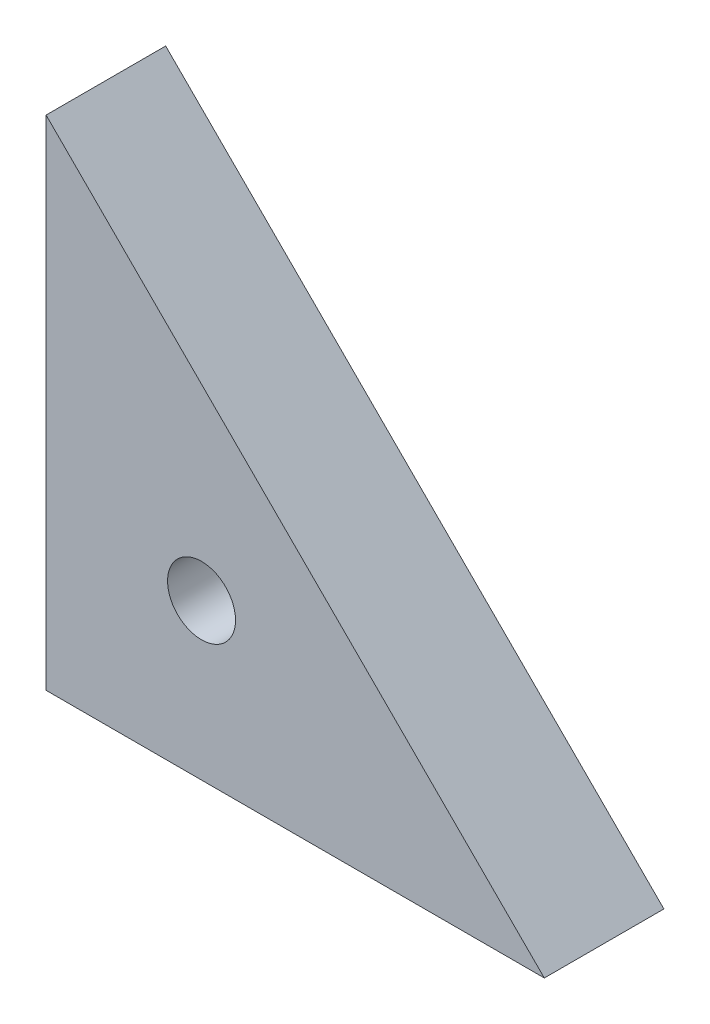
ISO-10303-21;
HEADER;
FILE_DESCRIPTION(('STEP AP214'),'2;1');
FILE_NAME('part.step','',(''),(''),'','','');
FILE_SCHEMA(('AUTOMOTIVE_DESIGN { 1 0 10303 214 1 1 1 1 }'));
ENDSEC;
DATA;
#1=APPLICATION_CONTEXT('core data for automotive mechanical design processes');
#2=APPLICATION_PROTOCOL_DEFINITION('international standard','automotive_design',2000,#1);
#3=PRODUCT_CONTEXT('',#1,'mechanical');
#4=PRODUCT('Part','Part','',(#3));
#5=PRODUCT_RELATED_PRODUCT_CATEGORY('part','',(#4));
#6=PRODUCT_DEFINITION_FORMATION('','',#4);
#7=PRODUCT_DEFINITION_CONTEXT('part definition',#1,'design');
#8=PRODUCT_DEFINITION('design','',#6,#7);
#9=PRODUCT_DEFINITION_SHAPE('','',#8);
#10=(LENGTH_UNIT() NAMED_UNIT(*) SI_UNIT(.MILLI.,.METRE.));
#11=(NAMED_UNIT(*) PLANE_ANGLE_UNIT() SI_UNIT($,.RADIAN.));
#12=(NAMED_UNIT(*) SI_UNIT($,.STERADIAN.) SOLID_ANGLE_UNIT());
#13=UNCERTAINTY_MEASURE_WITH_UNIT(LENGTH_MEASURE(1.E-05),#10,'distance_accuracy_value','');
#14=(GEOMETRIC_REPRESENTATION_CONTEXT(3) GLOBAL_UNCERTAINTY_ASSIGNED_CONTEXT((#13)) GLOBAL_UNIT_ASSIGNED_CONTEXT((#10,
#11,#12)) REPRESENTATION_CONTEXT('',''));
#15=CARTESIAN_POINT('',(0.,0.,0.));
#16=DIRECTION('',(0.,0.,1.));
#17=DIRECTION('',(1.,0.,0.));
#18=AXIS2_PLACEMENT_3D('',#15,#16,#17);
#19=CARTESIAN_POINT('',(0.,0.,6.));
#20=DIRECTION('',(0.,0.,-1.));
#21=DIRECTION('',(-1.,0.,0.));
#22=AXIS2_PLACEMENT_3D('',#19,#20,#21);
#23=PLANE('',#22);
#24=DIRECTION('',(1.,0.,0.));
#25=VECTOR('',#24,1.);
#26=CARTESIAN_POINT('',(25.,0.,6.));
#27=LINE('',#26,#25);
#28=CARTESIAN_POINT('',(0.,0.,6.));
#29=VERTEX_POINT('',#28);
#30=CARTESIAN_POINT('',(25.,0.,6.));
#31=VERTEX_POINT('',#30);
#32=EDGE_CURVE('E82',#29,#31,#27,.T.);
#33=ORIENTED_EDGE('',*,*,#32,.T.);
#34=DIRECTION('',(-0.707106781186547,0.707106781186547,0.));
#35=VECTOR('',#34,1.);
#36=CARTESIAN_POINT('',(0.,25.,6.));
#37=LINE('',#36,#35);
#38=CARTESIAN_POINT('',(0.,25.,6.));
#39=VERTEX_POINT('',#38);
#40=EDGE_CURVE('E77',#31,#39,#37,.T.);
#41=ORIENTED_EDGE('',*,*,#40,.T.);
#42=DIRECTION('',(0.,-1.,0.));
#43=VECTOR('',#42,1.);
#44=CARTESIAN_POINT('',(0.,0.,6.));
#45=LINE('',#44,#43);
#46=EDGE_CURVE('E57',#39,#29,#45,.T.);
#47=ORIENTED_EDGE('',*,*,#46,.T.);
#48=EDGE_LOOP('',(#33,#41,#47));
#49=FACE_BOUND('',#48,.T.);
#50=CARTESIAN_POINT('',(7.8,7.8,6.));
#51=DIRECTION('',(0.,0.,1.));
#52=DIRECTION('',(1.,0.,0.));
#53=AXIS2_PLACEMENT_3D('',#50,#51,#52);
#54=CIRCLE('',#53,1.705);
#55=CARTESIAN_POINT('',(9.505,7.8,6.));
#56=VERTEX_POINT('',#55);
#57=EDGE_CURVE('E94',#56,#56,#54,.T.);
#58=ORIENTED_EDGE('',*,*,#57,.F.);
#59=EDGE_LOOP('',(#58));
#60=FACE_BOUND('',#59,.T.);
#61=ADVANCED_FACE('F39',(#49,#60),#23,.F.);
#62=CARTESIAN_POINT('',(0.,0.,0.));
#63=DIRECTION('',(0.,0.,-1.));
#64=DIRECTION('',(-1.,0.,0.));
#65=AXIS2_PLACEMENT_3D('',#62,#63,#64);
#66=PLANE('',#65);
#67=DIRECTION('',(1.,0.,0.));
#68=VECTOR('',#67,1.);
#69=CARTESIAN_POINT('',(25.,0.,0.));
#70=LINE('',#69,#68);
#71=CARTESIAN_POINT('',(0.,0.,0.));
#72=VERTEX_POINT('',#71);
#73=CARTESIAN_POINT('',(25.,0.,0.));
#74=VERTEX_POINT('',#73);
#75=EDGE_CURVE('E90',#72,#74,#70,.T.);
#76=ORIENTED_EDGE('',*,*,#75,.F.);
#77=DIRECTION('',(0.,-1.,0.));
#78=VECTOR('',#77,1.);
#79=CARTESIAN_POINT('',(0.,0.,0.));
#80=LINE('',#79,#78);
#81=CARTESIAN_POINT('',(0.,25.,0.));
#82=VERTEX_POINT('',#81);
#83=EDGE_CURVE('E74',#82,#72,#80,.T.);
#84=ORIENTED_EDGE('',*,*,#83,.F.);
#85=DIRECTION('',(-0.707106781186547,0.707106781186547,0.));
#86=VECTOR('',#85,1.);
#87=CARTESIAN_POINT('',(0.,25.,0.));
#88=LINE('',#87,#86);
#89=EDGE_CURVE('E69',#74,#82,#88,.T.);
#90=ORIENTED_EDGE('',*,*,#89,.F.);
#91=EDGE_LOOP('',(#76,#84,#90));
#92=FACE_BOUND('',#91,.T.);
#93=CARTESIAN_POINT('',(7.8,7.8,0.));
#94=DIRECTION('',(0.,0.,1.));
#95=DIRECTION('',(1.,0.,0.));
#96=AXIS2_PLACEMENT_3D('',#93,#94,#95);
#97=CIRCLE('',#96,1.705);
#98=CARTESIAN_POINT('',(9.505,7.8,0.));
#99=VERTEX_POINT('',#98);
#100=EDGE_CURVE('E100',#99,#99,#97,.T.);
#101=ORIENTED_EDGE('',*,*,#100,.T.);
#102=EDGE_LOOP('',(#101));
#103=FACE_BOUND('',#102,.T.);
#104=ADVANCED_FACE('F109',(#92,#103),#66,.T.);
#105=CARTESIAN_POINT('',(25.,0.,6.));
#106=DIRECTION('',(0.,1.,0.));
#107=DIRECTION('',(-1.,0.,0.));
#108=AXIS2_PLACEMENT_3D('',#105,#106,#107);
#109=PLANE('',#108);
#110=ORIENTED_EDGE('',*,*,#75,.T.);
#111=DIRECTION('',(0.,0.,-1.));
#112=VECTOR('',#111,1.);
#113=CARTESIAN_POINT('',(25.,0.,6.));
#114=LINE('',#113,#112);
#115=EDGE_CURVE('E11',#31,#74,#114,.T.);
#116=ORIENTED_EDGE('',*,*,#115,.F.);
#117=ORIENTED_EDGE('',*,*,#32,.F.);
#118=DIRECTION('',(0.,0.,-1.));
#119=VECTOR('',#118,1.);
#120=CARTESIAN_POINT('',(0.,0.,6.));
#121=LINE('',#120,#119);
#122=EDGE_CURVE('E91',#29,#72,#121,.T.);
#123=ORIENTED_EDGE('',*,*,#122,.T.);
#124=EDGE_LOOP('',(#110,#116,#117,#123));
#125=FACE_BOUND('',#124,.T.);
#126=ADVANCED_FACE('F41',(#125),#109,.F.);
#127=CARTESIAN_POINT('',(0.,25.,6.));
#128=DIRECTION('',(-0.707106781186548,-0.707106781186548,0.));
#129=DIRECTION('',(0.707106781186548,-0.707106781186548,0.));
#130=AXIS2_PLACEMENT_3D('',#127,#128,#129);
#131=PLANE('',#130);
#132=ORIENTED_EDGE('',*,*,#89,.T.);
#133=DIRECTION('',(0.,0.,-1.));
#134=VECTOR('',#133,1.);
#135=CARTESIAN_POINT('',(0.,25.,6.));
#136=LINE('',#135,#134);
#137=EDGE_CURVE('E49',#39,#82,#136,.T.);
#138=ORIENTED_EDGE('',*,*,#137,.F.);
#139=ORIENTED_EDGE('',*,*,#40,.F.);
#140=ORIENTED_EDGE('',*,*,#115,.T.);
#141=EDGE_LOOP('',(#132,#138,#139,#140));
#142=FACE_BOUND('',#141,.T.);
#143=ADVANCED_FACE('F78',(#142),#131,.F.);
#144=CARTESIAN_POINT('',(0.,0.,6.));
#145=DIRECTION('',(1.,0.,0.));
#146=DIRECTION('',(0.,0.,-1.));
#147=AXIS2_PLACEMENT_3D('',#144,#145,#146);
#148=PLANE('',#147);
#149=ORIENTED_EDGE('',*,*,#83,.T.);
#150=ORIENTED_EDGE('',*,*,#122,.F.);
#151=ORIENTED_EDGE('',*,*,#46,.F.);
#152=ORIENTED_EDGE('',*,*,#137,.T.);
#153=EDGE_LOOP('',(#149,#150,#151,#152));
#154=FACE_BOUND('',#153,.T.);
#155=ADVANCED_FACE('F108',(#154),#148,.F.);
#156=CARTESIAN_POINT('',(7.8,7.8,6.));
#157=DIRECTION('',(0.,0.,-1.));
#158=DIRECTION('',(-1.,0.,0.));
#159=AXIS2_PLACEMENT_3D('',#156,#157,#158);
#160=CYLINDRICAL_SURFACE('',#159,1.705);
#161=ORIENTED_EDGE('',*,*,#57,.T.);
#162=EDGE_LOOP('',(#161));
#163=FACE_BOUND('',#162,.T.);
#164=ORIENTED_EDGE('',*,*,#100,.F.);
#165=EDGE_LOOP('',(#164));
#166=FACE_BOUND('',#165,.T.);
#167=ADVANCED_FACE('F118',(#163,#166),#160,.F.);
#168=CLOSED_SHELL('',(#61,#104,#126,#143,#155,#167));
#169=MANIFOLD_SOLID_BREP('B2',#168);
#170=ADVANCED_BREP_SHAPE_REPRESENTATION('',(#18,#169),#14);
#171=SHAPE_DEFINITION_REPRESENTATION(#9,#170);
ENDSEC;
END-ISO-10303-21;
